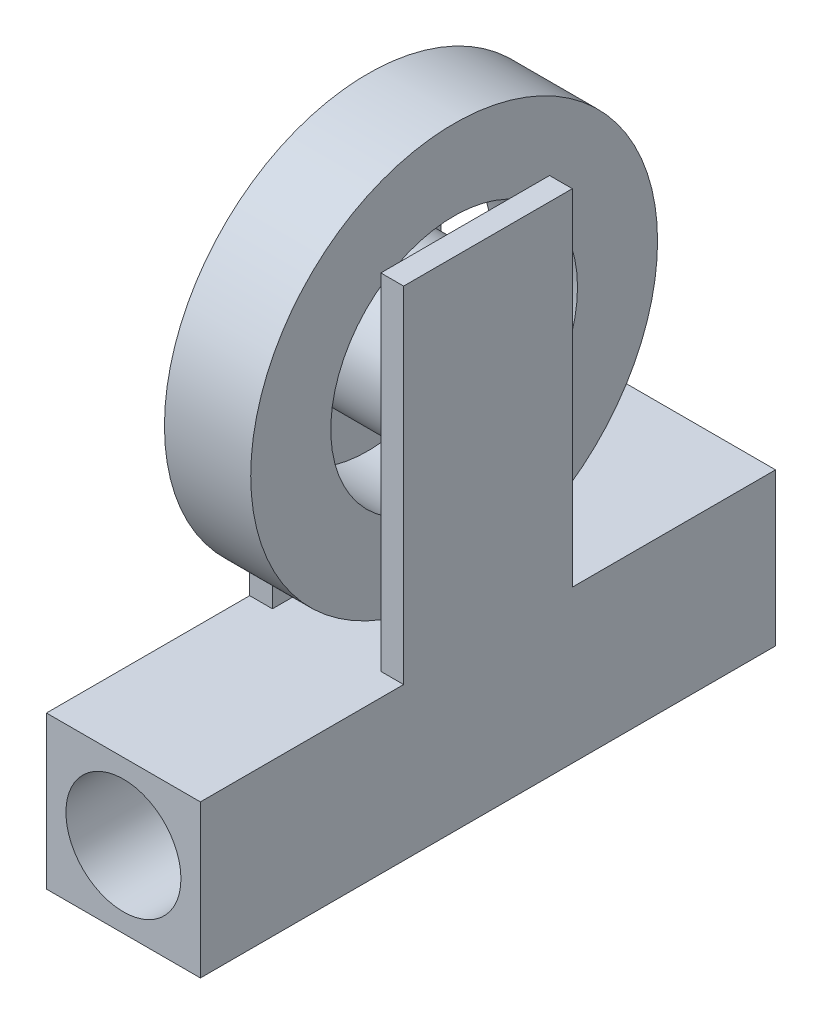
ISO-10303-21;
HEADER;
FILE_DESCRIPTION(('STEP AP214'),'2;1');
FILE_NAME('part.step','',(''),(''),'','','');
FILE_SCHEMA(('AUTOMOTIVE_DESIGN { 1 0 10303 214 1 1 1 1 }'));
ENDSEC;
DATA;
#1=APPLICATION_CONTEXT('core data for automotive mechanical design processes');
#2=APPLICATION_PROTOCOL_DEFINITION('international standard','automotive_design',2000,#1);
#3=PRODUCT_CONTEXT('',#1,'mechanical');
#4=PRODUCT('Part','Part','',(#3));
#5=PRODUCT_RELATED_PRODUCT_CATEGORY('part','',(#4));
#6=PRODUCT_DEFINITION_FORMATION('','',#4);
#7=PRODUCT_DEFINITION_CONTEXT('part definition',#1,'design');
#8=PRODUCT_DEFINITION('design','',#6,#7);
#9=PRODUCT_DEFINITION_SHAPE('','',#8);
#10=(LENGTH_UNIT() NAMED_UNIT(*) SI_UNIT(.MILLI.,.METRE.));
#11=(NAMED_UNIT(*) PLANE_ANGLE_UNIT() SI_UNIT($,.RADIAN.));
#12=(NAMED_UNIT(*) SI_UNIT($,.STERADIAN.) SOLID_ANGLE_UNIT());
#13=UNCERTAINTY_MEASURE_WITH_UNIT(LENGTH_MEASURE(1.E-05),#10,'distance_accuracy_value','');
#14=(GEOMETRIC_REPRESENTATION_CONTEXT(3) GLOBAL_UNCERTAINTY_ASSIGNED_CONTEXT((#13)) GLOBAL_UNIT_ASSIGNED_CONTEXT((#10,
#11,#12)) REPRESENTATION_CONTEXT('',''));
#15=CARTESIAN_POINT('',(0.,0.,0.));
#16=DIRECTION('',(0.,0.,1.));
#17=DIRECTION('',(1.,0.,0.));
#18=AXIS2_PLACEMENT_3D('',#15,#16,#17);
#19=CARTESIAN_POINT('',(7.5,52.0991490363418,50.));
#20=DIRECTION('',(1.,0.,0.));
#21=DIRECTION('',(0.,0.,-1.));
#22=AXIS2_PLACEMENT_3D('',#19,#20,#21);
#23=PLANE('',#22);
#24=CARTESIAN_POINT('',(7.5,52.0991490363418,50.));
#25=DIRECTION('',(1.,0.,0.));
#26=DIRECTION('',(0.,0.,-1.));
#27=AXIS2_PLACEMENT_3D('',#24,#25,#26);
#28=CIRCLE('',#27,35.3684202723915);
#29=CARTESIAN_POINT('',(7.5,52.0991490363418,14.6315797276085));
#30=VERTEX_POINT('',#29);
#31=EDGE_CURVE('E11',#30,#30,#28,.T.);
#32=ORIENTED_EDGE('',*,*,#31,.T.);
#33=EDGE_LOOP('',(#32));
#34=FACE_BOUND('',#33,.T.);
#35=CARTESIAN_POINT('',(7.5,52.0991490363418,50.));
#36=DIRECTION('',(1.,0.,0.));
#37=DIRECTION('',(0.,0.,-1.));
#38=AXIS2_PLACEMENT_3D('',#35,#36,#37);
#39=CIRCLE('',#38,21.4506027690178);
#40=CARTESIAN_POINT('',(7.5,52.0991490363418,28.5493972309823));
#41=VERTEX_POINT('',#40);
#42=EDGE_CURVE('E62',#41,#41,#39,.T.);
#43=ORIENTED_EDGE('',*,*,#42,.F.);
#44=EDGE_LOOP('',(#43));
#45=FACE_BOUND('',#44,.T.);
#46=ADVANCED_FACE('F51',(#34,#45),#23,.T.);
#47=CARTESIAN_POINT('',(-7.5,52.0991490363418,50.));
#48=DIRECTION('',(1.,0.,0.));
#49=DIRECTION('',(0.,0.,-1.));
#50=AXIS2_PLACEMENT_3D('',#47,#48,#49);
#51=PLANE('',#50);
#52=CARTESIAN_POINT('',(-7.5,52.0991490363418,50.));
#53=DIRECTION('',(1.,0.,0.));
#54=DIRECTION('',(0.,0.,-1.));
#55=AXIS2_PLACEMENT_3D('',#52,#53,#54);
#56=CIRCLE('',#55,35.3684202723915);
#57=CARTESIAN_POINT('',(-7.5,52.0991490363418,14.6315797276085));
#58=VERTEX_POINT('',#57);
#59=EDGE_CURVE('E55',#58,#58,#56,.T.);
#60=ORIENTED_EDGE('',*,*,#59,.F.);
#61=EDGE_LOOP('',(#60));
#62=FACE_BOUND('',#61,.T.);
#63=CARTESIAN_POINT('',(-7.5,52.0991490363418,50.));
#64=DIRECTION('',(1.,0.,0.));
#65=DIRECTION('',(0.,0.,-1.));
#66=AXIS2_PLACEMENT_3D('',#63,#64,#65);
#67=CIRCLE('',#66,21.4506027690178);
#68=CARTESIAN_POINT('',(-7.5,52.0991490363418,28.5493972309823));
#69=VERTEX_POINT('',#68);
#70=EDGE_CURVE('E64',#69,#69,#67,.T.);
#71=ORIENTED_EDGE('',*,*,#70,.T.);
#72=EDGE_LOOP('',(#71));
#73=FACE_BOUND('',#72,.T.);
#74=ADVANCED_FACE('F74',(#62,#73),#51,.F.);
#75=CARTESIAN_POINT('',(7.5,52.0991490363418,50.));
#76=DIRECTION('',(-1.,0.,0.));
#77=DIRECTION('',(0.,0.,1.));
#78=AXIS2_PLACEMENT_3D('',#75,#76,#77);
#79=CYLINDRICAL_SURFACE('',#78,35.3684202723915);
#80=ORIENTED_EDGE('',*,*,#31,.F.);
#81=EDGE_LOOP('',(#80));
#82=FACE_BOUND('',#81,.T.);
#83=ORIENTED_EDGE('',*,*,#59,.T.);
#84=EDGE_LOOP('',(#83));
#85=FACE_BOUND('',#84,.T.);
#86=ADVANCED_FACE('F53',(#82,#85),#79,.T.);
#87=CARTESIAN_POINT('',(7.5,52.0991490363418,50.));
#88=DIRECTION('',(-1.,0.,0.));
#89=DIRECTION('',(0.,0.,1.));
#90=AXIS2_PLACEMENT_3D('',#87,#88,#89);
#91=CYLINDRICAL_SURFACE('',#90,21.4506027690178);
#92=ORIENTED_EDGE('',*,*,#42,.T.);
#93=EDGE_LOOP('',(#92));
#94=FACE_BOUND('',#93,.T.);
#95=ORIENTED_EDGE('',*,*,#70,.F.);
#96=EDGE_LOOP('',(#95));
#97=FACE_BOUND('',#96,.T.);
#98=ADVANCED_FACE('F70',(#94,#97),#91,.F.);
#99=CLOSED_SHELL('',(#46,#74,#86,#98));
#100=MANIFOLD_SOLID_BREP('B2',#99);
#101=CARTESIAN_POINT('',(-13.3844816451149,13.2593930316092,100.));
#102=DIRECTION('',(0.,-1.,0.));
#103=DIRECTION('',(0.,0.,-1.));
#104=AXIS2_PLACEMENT_3D('',#101,#102,#103);
#105=PLANE('',#104);
#106=DIRECTION('',(1.,0.,0.));
#107=VECTOR('',#106,1.);
#108=CARTESIAN_POINT('',(13.3844816451149,13.2593930316092,64.6654291948844));
#109=LINE('',#108,#107);
#110=CARTESIAN_POINT('',(9.42369725511215,13.2593930316092,64.6654291948844));
#111=VERTEX_POINT('',#110);
#112=CARTESIAN_POINT('',(13.3844816451149,13.2593930316092,64.6654291948844));
#113=VERTEX_POINT('',#112);
#114=EDGE_CURVE('E137',#111,#113,#109,.T.);
#115=ORIENTED_EDGE('',*,*,#114,.F.);
#116=DIRECTION('',(0.,0.,1.));
#117=VECTOR('',#116,1.);
#118=CARTESIAN_POINT('',(9.42369725511215,13.2593930316092,64.6654291948844));
#119=LINE('',#118,#117);
#120=CARTESIAN_POINT('',(9.42369725511215,13.2593930316092,35.3345708051156));
#121=VERTEX_POINT('',#120);
#122=EDGE_CURVE('E142',#121,#111,#119,.T.);
#123=ORIENTED_EDGE('',*,*,#122,.F.);
#124=DIRECTION('',(-1.,0.,0.));
#125=VECTOR('',#124,1.);
#126=CARTESIAN_POINT('',(9.42369725511215,13.2593930316092,35.3345708051156));
#127=LINE('',#126,#125);
#128=CARTESIAN_POINT('',(13.3844816451149,13.2593930316092,35.3345708051156));
#129=VERTEX_POINT('',#128);
#130=EDGE_CURVE('E222',#129,#121,#127,.T.);
#131=ORIENTED_EDGE('',*,*,#130,.F.);
#132=DIRECTION('',(0.,0.,-1.));
#133=VECTOR('',#132,1.);
#134=CARTESIAN_POINT('',(13.3844816451149,13.2593930316092,100.));
#135=LINE('',#134,#133);
#136=CARTESIAN_POINT('',(13.3844816451149,13.2593930316092,0.));
#137=VERTEX_POINT('',#136);
#138=EDGE_CURVE('E131',#129,#137,#135,.T.);
#139=ORIENTED_EDGE('',*,*,#138,.T.);
#140=DIRECTION('',(-1.,0.,0.));
#141=VECTOR('',#140,1.);
#142=CARTESIAN_POINT('',(-13.3844816451149,13.2593930316092,0.));
#143=LINE('',#142,#141);
#144=CARTESIAN_POINT('',(-13.3844816451149,13.2593930316092,0.));
#145=VERTEX_POINT('',#144);
#146=EDGE_CURVE('E324',#137,#145,#143,.T.);
#147=ORIENTED_EDGE('',*,*,#146,.T.);
#148=DIRECTION('',(0.,0.,-1.));
#149=VECTOR('',#148,1.);
#150=CARTESIAN_POINT('',(-13.3844816451149,13.2593930316092,100.));
#151=LINE('',#150,#149);
#152=CARTESIAN_POINT('',(-13.3844816451149,13.2593930316092,35.3345708051156));
#153=VERTEX_POINT('',#152);
#154=EDGE_CURVE('E338',#153,#145,#151,.T.);
#155=ORIENTED_EDGE('',*,*,#154,.F.);
#156=DIRECTION('',(-1.,0.,0.));
#157=VECTOR('',#156,1.);
#158=CARTESIAN_POINT('',(-9.42369725511215,13.2593930316092,35.3345708051156));
#159=LINE('',#158,#157);
#160=CARTESIAN_POINT('',(-9.42369725511215,13.2593930316092,35.3345708051156));
#161=VERTEX_POINT('',#160);
#162=EDGE_CURVE('E247',#161,#153,#159,.T.);
#163=ORIENTED_EDGE('',*,*,#162,.F.);
#164=DIRECTION('',(0.,0.,-1.));
#165=VECTOR('',#164,1.);
#166=CARTESIAN_POINT('',(-9.42369725511215,13.2593930316092,64.6654291948844));
#167=LINE('',#166,#165);
#168=CARTESIAN_POINT('',(-9.42369725511215,13.2593930316092,64.6654291948844));
#169=VERTEX_POINT('',#168);
#170=EDGE_CURVE('E264',#169,#161,#167,.T.);
#171=ORIENTED_EDGE('',*,*,#170,.F.);
#172=DIRECTION('',(1.,0.,0.));
#173=VECTOR('',#172,1.);
#174=CARTESIAN_POINT('',(-13.3844816451149,13.2593930316092,64.6654291948844));
#175=LINE('',#174,#173);
#176=CARTESIAN_POINT('',(-13.3844816451149,13.2593930316092,64.6654291948844));
#177=VERTEX_POINT('',#176);
#178=EDGE_CURVE('E277',#177,#169,#175,.T.);
#179=ORIENTED_EDGE('',*,*,#178,.F.);
#180=CARTESIAN_POINT('',(-13.3844816451149,13.2593930316092,100.));
#181=VERTEX_POINT('',#180);
#182=EDGE_CURVE('E221',#181,#177,#151,.T.);
#183=ORIENTED_EDGE('',*,*,#182,.F.);
#184=DIRECTION('',(-1.,0.,0.));
#185=VECTOR('',#184,1.);
#186=CARTESIAN_POINT('',(-13.3844816451149,13.2593930316092,100.));
#187=LINE('',#186,#185);
#188=CARTESIAN_POINT('',(13.3844816451149,13.2593930316092,100.));
#189=VERTEX_POINT('',#188);
#190=EDGE_CURVE('E311',#189,#181,#187,.T.);
#191=ORIENTED_EDGE('',*,*,#190,.F.);
#192=EDGE_CURVE('E49',#189,#113,#135,.T.);
#193=ORIENTED_EDGE('',*,*,#192,.T.);
#194=EDGE_LOOP('',(#115,#123,#131,#139,#147,#155,#163,#171,#179,#183,#191,#193));
#195=FACE_BOUND('',#194,.T.);
#196=ADVANCED_FACE('F121',(#195),#105,.F.);
#197=CARTESIAN_POINT('',(0.,0.,100.));
#198=DIRECTION('',(0.,0.,1.));
#199=DIRECTION('',(1.,0.,0.));
#200=AXIS2_PLACEMENT_3D('',#197,#198,#199);
#201=PLANE('',#200);
#202=DIRECTION('',(0.,1.,0.));
#203=VECTOR('',#202,1.);
#204=CARTESIAN_POINT('',(13.3844816451149,13.2593930316092,100.));
#205=LINE('',#204,#203);
#206=CARTESIAN_POINT('',(13.3844816451149,-13.2593930316092,100.));
#207=VERTEX_POINT('',#206);
#208=EDGE_CURVE('E307',#207,#189,#205,.T.);
#209=ORIENTED_EDGE('',*,*,#208,.T.);
#210=ORIENTED_EDGE('',*,*,#190,.T.);
#211=DIRECTION('',(0.,-1.,0.));
#212=VECTOR('',#211,1.);
#213=CARTESIAN_POINT('',(-13.3844816451149,13.2593930316092,100.));
#214=LINE('',#213,#212);
#215=CARTESIAN_POINT('',(-13.3844816451149,-13.2593930316092,100.));
#216=VERTEX_POINT('',#215);
#217=EDGE_CURVE('E315',#181,#216,#214,.T.);
#218=ORIENTED_EDGE('',*,*,#217,.T.);
#219=DIRECTION('',(1.,0.,0.));
#220=VECTOR('',#219,1.);
#221=CARTESIAN_POINT('',(-13.3844816451149,-13.2593930316092,100.));
#222=LINE('',#221,#220);
#223=EDGE_CURVE('E318',#216,#207,#222,.T.);
#224=ORIENTED_EDGE('',*,*,#223,.T.);
#225=EDGE_LOOP('',(#209,#210,#218,#224));
#226=FACE_BOUND('',#225,.T.);
#227=CARTESIAN_POINT('',(0.,0.,100.));
#228=DIRECTION('',(0.,0.,1.));
#229=DIRECTION('',(1.,0.,0.));
#230=AXIS2_PLACEMENT_3D('',#227,#228,#229);
#231=CIRCLE('',#230,10.);
#232=CARTESIAN_POINT('',(10.,0.,100.));
#233=VERTEX_POINT('',#232);
#234=EDGE_CURVE('E300',#233,#233,#231,.T.);
#235=ORIENTED_EDGE('',*,*,#234,.F.);
#236=EDGE_LOOP('',(#235));
#237=FACE_BOUND('',#236,.T.);
#238=ADVANCED_FACE('F361',(#226,#237),#201,.T.);
#239=CARTESIAN_POINT('',(0.,0.,0.));
#240=DIRECTION('',(0.,0.,1.));
#241=DIRECTION('',(1.,0.,0.));
#242=AXIS2_PLACEMENT_3D('',#239,#240,#241);
#243=PLANE('',#242);
#244=DIRECTION('',(0.,1.,0.));
#245=VECTOR('',#244,1.);
#246=CARTESIAN_POINT('',(13.3844816451149,13.2593930316092,0.));
#247=LINE('',#246,#245);
#248=CARTESIAN_POINT('',(13.3844816451149,-13.2593930316092,0.));
#249=VERTEX_POINT('',#248);
#250=EDGE_CURVE('E217',#249,#137,#247,.T.);
#251=ORIENTED_EDGE('',*,*,#250,.F.);
#252=DIRECTION('',(1.,0.,0.));
#253=VECTOR('',#252,1.);
#254=CARTESIAN_POINT('',(-13.3844816451149,-13.2593930316092,0.));
#255=LINE('',#254,#253);
#256=CARTESIAN_POINT('',(-13.3844816451149,-13.2593930316092,0.));
#257=VERTEX_POINT('',#256);
#258=EDGE_CURVE('E312',#257,#249,#255,.T.);
#259=ORIENTED_EDGE('',*,*,#258,.F.);
#260=DIRECTION('',(0.,-1.,0.));
#261=VECTOR('',#260,1.);
#262=CARTESIAN_POINT('',(-13.3844816451149,13.2593930316092,0.));
#263=LINE('',#262,#261);
#264=EDGE_CURVE('E327',#145,#257,#263,.T.);
#265=ORIENTED_EDGE('',*,*,#264,.F.);
#266=ORIENTED_EDGE('',*,*,#146,.F.);
#267=EDGE_LOOP('',(#251,#259,#265,#266));
#268=FACE_BOUND('',#267,.T.);
#269=CARTESIAN_POINT('',(0.,0.,0.));
#270=DIRECTION('',(0.,0.,1.));
#271=DIRECTION('',(1.,0.,0.));
#272=AXIS2_PLACEMENT_3D('',#269,#270,#271);
#273=CIRCLE('',#272,10.);
#274=CARTESIAN_POINT('',(10.,0.,0.));
#275=VERTEX_POINT('',#274);
#276=EDGE_CURVE('E299',#275,#275,#273,.T.);
#277=ORIENTED_EDGE('',*,*,#276,.T.);
#278=EDGE_LOOP('',(#277));
#279=FACE_BOUND('',#278,.T.);
#280=ADVANCED_FACE('F352',(#268,#279),#243,.F.);
#281=CARTESIAN_POINT('',(13.3844816451149,13.2593930316092,100.));
#282=DIRECTION('',(-1.,0.,0.));
#283=DIRECTION('',(0.,0.,1.));
#284=AXIS2_PLACEMENT_3D('',#281,#282,#283);
#285=PLANE('',#284);
#286=ORIENTED_EDGE('',*,*,#250,.T.);
#287=ORIENTED_EDGE('',*,*,#138,.F.);
#288=DIRECTION('',(0.,-1.,0.));
#289=VECTOR('',#288,1.);
#290=CARTESIAN_POINT('',(13.3844816451149,73.2593930316092,35.3345708051156));
#291=LINE('',#290,#289);
#292=CARTESIAN_POINT('',(13.3844816451149,73.2593930316092,35.3345708051156));
#293=VERTEX_POINT('',#292);
#294=EDGE_CURVE('E213',#293,#129,#291,.T.);
#295=ORIENTED_EDGE('',*,*,#294,.F.);
#296=DIRECTION('',(0.,0.,-1.));
#297=VECTOR('',#296,1.);
#298=CARTESIAN_POINT('',(13.3844816451149,73.2593930316092,35.3345708051156));
#299=LINE('',#298,#297);
#300=CARTESIAN_POINT('',(13.3844816451149,73.2593930316092,64.6654291948844));
#301=VERTEX_POINT('',#300);
#302=EDGE_CURVE('E250',#301,#293,#299,.T.);
#303=ORIENTED_EDGE('',*,*,#302,.F.);
#304=DIRECTION('',(0.,-1.,0.));
#305=VECTOR('',#304,1.);
#306=CARTESIAN_POINT('',(13.3844816451149,73.2593930316092,64.6654291948844));
#307=LINE('',#306,#305);
#308=EDGE_CURVE('E233',#301,#113,#307,.T.);
#309=ORIENTED_EDGE('',*,*,#308,.T.);
#310=ORIENTED_EDGE('',*,*,#192,.F.);
#311=ORIENTED_EDGE('',*,*,#208,.F.);
#312=DIRECTION('',(0.,0.,-1.));
#313=VECTOR('',#312,1.);
#314=CARTESIAN_POINT('',(13.3844816451149,-13.2593930316092,100.));
#315=LINE('',#314,#313);
#316=EDGE_CURVE('E321',#207,#249,#315,.T.);
#317=ORIENTED_EDGE('',*,*,#316,.T.);
#318=EDGE_LOOP('',(#286,#287,#295,#303,#309,#310,#311,#317));
#319=FACE_BOUND('',#318,.T.);
#320=ADVANCED_FACE('F123',(#319),#285,.F.);
#321=CARTESIAN_POINT('',(-13.3844816451149,13.2593930316092,100.));
#322=DIRECTION('',(1.,0.,0.));
#323=DIRECTION('',(0.,0.,-1.));
#324=AXIS2_PLACEMENT_3D('',#321,#322,#323);
#325=PLANE('',#324);
#326=ORIENTED_EDGE('',*,*,#264,.T.);
#327=DIRECTION('',(0.,0.,-1.));
#328=VECTOR('',#327,1.);
#329=CARTESIAN_POINT('',(-13.3844816451149,-13.2593930316092,100.));
#330=LINE('',#329,#328);
#331=EDGE_CURVE('E334',#216,#257,#330,.T.);
#332=ORIENTED_EDGE('',*,*,#331,.F.);
#333=ORIENTED_EDGE('',*,*,#217,.F.);
#334=ORIENTED_EDGE('',*,*,#182,.T.);
#335=DIRECTION('',(0.,-1.,0.));
#336=VECTOR('',#335,1.);
#337=CARTESIAN_POINT('',(-13.3844816451149,73.2593930316092,64.6654291948844));
#338=LINE('',#337,#336);
#339=CARTESIAN_POINT('',(-13.3844816451149,73.2593930316092,64.6654291948844));
#340=VERTEX_POINT('',#339);
#341=EDGE_CURVE('E291',#340,#177,#338,.T.);
#342=ORIENTED_EDGE('',*,*,#341,.F.);
#343=DIRECTION('',(0.,0.,1.));
#344=VECTOR('',#343,1.);
#345=CARTESIAN_POINT('',(-13.3844816451149,73.2593930316092,35.3345708051156));
#346=LINE('',#345,#344);
#347=CARTESIAN_POINT('',(-13.3844816451149,73.2593930316092,35.3345708051156));
#348=VERTEX_POINT('',#347);
#349=EDGE_CURVE('E263',#348,#340,#346,.T.);
#350=ORIENTED_EDGE('',*,*,#349,.F.);
#351=DIRECTION('',(0.,-1.,0.));
#352=VECTOR('',#351,1.);
#353=CARTESIAN_POINT('',(-13.3844816451149,73.2593930316092,35.3345708051156));
#354=LINE('',#353,#352);
#355=EDGE_CURVE('E295',#348,#153,#354,.T.);
#356=ORIENTED_EDGE('',*,*,#355,.T.);
#357=ORIENTED_EDGE('',*,*,#154,.T.);
#358=EDGE_LOOP('',(#326,#332,#333,#334,#342,#350,#356,#357));
#359=FACE_BOUND('',#358,.T.);
#360=ADVANCED_FACE('F346',(#359),#325,.F.);
#361=CARTESIAN_POINT('',(-13.3844816451149,-13.2593930316092,100.));
#362=DIRECTION('',(0.,1.,0.));
#363=DIRECTION('',(0.,0.,1.));
#364=AXIS2_PLACEMENT_3D('',#361,#362,#363);
#365=PLANE('',#364);
#366=ORIENTED_EDGE('',*,*,#258,.T.);
#367=ORIENTED_EDGE('',*,*,#316,.F.);
#368=ORIENTED_EDGE('',*,*,#223,.F.);
#369=ORIENTED_EDGE('',*,*,#331,.T.);
#370=EDGE_LOOP('',(#366,#367,#368,#369));
#371=FACE_BOUND('',#370,.T.);
#372=ADVANCED_FACE('F356',(#371),#365,.F.);
#373=CARTESIAN_POINT('',(0.,0.,100.));
#374=DIRECTION('',(0.,0.,-1.));
#375=DIRECTION('',(-1.,0.,0.));
#376=AXIS2_PLACEMENT_3D('',#373,#374,#375);
#377=CYLINDRICAL_SURFACE('',#376,10.);
#378=ORIENTED_EDGE('',*,*,#234,.T.);
#379=EDGE_LOOP('',(#378));
#380=FACE_BOUND('',#379,.T.);
#381=ORIENTED_EDGE('',*,*,#276,.F.);
#382=EDGE_LOOP('',(#381));
#383=FACE_BOUND('',#382,.T.);
#384=ADVANCED_FACE('F377',(#380,#383),#377,.F.);
#385=CARTESIAN_POINT('',(-9.42369725511215,73.2593930316092,35.3345708051156));
#386=DIRECTION('',(0.,0.,1.));
#387=DIRECTION('',(1.,0.,0.));
#388=AXIS2_PLACEMENT_3D('',#385,#386,#387);
#389=PLANE('',#388);
#390=ORIENTED_EDGE('',*,*,#162,.T.);
#391=ORIENTED_EDGE('',*,*,#355,.F.);
#392=DIRECTION('',(-1.,0.,0.));
#393=VECTOR('',#392,1.);
#394=CARTESIAN_POINT('',(-9.42369725511215,73.2593930316092,35.3345708051156));
#395=LINE('',#394,#393);
#396=CARTESIAN_POINT('',(-9.42369725511215,73.2593930316092,35.3345708051156));
#397=VERTEX_POINT('',#396);
#398=EDGE_CURVE('E259',#397,#348,#395,.T.);
#399=ORIENTED_EDGE('',*,*,#398,.F.);
#400=DIRECTION('',(0.,-1.,0.));
#401=VECTOR('',#400,1.);
#402=CARTESIAN_POINT('',(-9.42369725511215,73.2593930316092,35.3345708051156));
#403=LINE('',#402,#401);
#404=EDGE_CURVE('E273',#397,#161,#403,.T.);
#405=ORIENTED_EDGE('',*,*,#404,.T.);
#406=EDGE_LOOP('',(#390,#391,#399,#405));
#407=FACE_BOUND('',#406,.T.);
#408=ADVANCED_FACE('F375',(#407),#389,.F.);
#409=CARTESIAN_POINT('',(-13.3844816451149,73.2593930316092,64.6654291948844));
#410=DIRECTION('',(0.,0.,-1.));
#411=DIRECTION('',(-1.,0.,0.));
#412=AXIS2_PLACEMENT_3D('',#409,#410,#411);
#413=PLANE('',#412);
#414=ORIENTED_EDGE('',*,*,#178,.T.);
#415=DIRECTION('',(0.,-1.,0.));
#416=VECTOR('',#415,1.);
#417=CARTESIAN_POINT('',(-9.42369725511215,73.2593930316092,64.6654291948844));
#418=LINE('',#417,#416);
#419=CARTESIAN_POINT('',(-9.42369725511215,73.2593930316092,64.6654291948844));
#420=VERTEX_POINT('',#419);
#421=EDGE_CURVE('E287',#420,#169,#418,.T.);
#422=ORIENTED_EDGE('',*,*,#421,.F.);
#423=DIRECTION('',(1.,0.,0.));
#424=VECTOR('',#423,1.);
#425=CARTESIAN_POINT('',(-13.3844816451149,73.2593930316092,64.6654291948844));
#426=LINE('',#425,#424);
#427=EDGE_CURVE('E267',#340,#420,#426,.T.);
#428=ORIENTED_EDGE('',*,*,#427,.F.);
#429=ORIENTED_EDGE('',*,*,#341,.T.);
#430=EDGE_LOOP('',(#414,#422,#428,#429));
#431=FACE_BOUND('',#430,.T.);
#432=ADVANCED_FACE('F365',(#431),#413,.F.);
#433=CARTESIAN_POINT('',(-9.42369725511215,73.2593930316092,64.6654291948844));
#434=DIRECTION('',(-1.,0.,0.));
#435=DIRECTION('',(0.,0.,1.));
#436=AXIS2_PLACEMENT_3D('',#433,#434,#435);
#437=PLANE('',#436);
#438=CARTESIAN_POINT('',(-9.42369725511215,52.0991490363418,50.));
#439=DIRECTION('',(-1.,0.,0.));
#440=DIRECTION('',(0.,0.,1.));
#441=AXIS2_PLACEMENT_3D('',#438,#439,#440);
#442=CIRCLE('',#441,12.7426514114775);
#443=CARTESIAN_POINT('',(-9.42369725511215,52.0991490363418,62.7426514114775));
#444=VERTEX_POINT('',#443);
#445=EDGE_CURVE('E534',#444,#444,#442,.F.);
#446=ORIENTED_EDGE('',*,*,#445,.F.);
#447=EDGE_LOOP('',(#446));
#448=FACE_BOUND('',#447,.T.);
#449=ORIENTED_EDGE('',*,*,#170,.T.);
#450=ORIENTED_EDGE('',*,*,#404,.F.);
#451=DIRECTION('',(0.,0.,-1.));
#452=VECTOR('',#451,1.);
#453=CARTESIAN_POINT('',(-9.42369725511215,73.2593930316092,64.6654291948844));
#454=LINE('',#453,#452);
#455=EDGE_CURVE('E270',#420,#397,#454,.T.);
#456=ORIENTED_EDGE('',*,*,#455,.F.);
#457=ORIENTED_EDGE('',*,*,#421,.T.);
#458=EDGE_LOOP('',(#449,#450,#456,#457));
#459=FACE_BOUND('',#458,.T.);
#460=ADVANCED_FACE('F369',(#448,#459),#437,.F.);
#461=CARTESIAN_POINT('',(0.,73.2593930316092,0.));
#462=DIRECTION('',(0.,1.,0.));
#463=DIRECTION('',(0.,0.,1.));
#464=AXIS2_PLACEMENT_3D('',#461,#462,#463);
#465=PLANE('',#464);
#466=ORIENTED_EDGE('',*,*,#398,.T.);
#467=ORIENTED_EDGE('',*,*,#349,.T.);
#468=ORIENTED_EDGE('',*,*,#427,.T.);
#469=ORIENTED_EDGE('',*,*,#455,.T.);
#470=EDGE_LOOP('',(#466,#467,#468,#469));
#471=FACE_BOUND('',#470,.T.);
#472=ADVANCED_FACE('F373',(#471),#465,.T.);
#473=CARTESIAN_POINT('',(9.42369725511215,73.2593930316092,64.6654291948844));
#474=DIRECTION('',(1.,0.,0.));
#475=DIRECTION('',(0.,0.,-1.));
#476=AXIS2_PLACEMENT_3D('',#473,#474,#475);
#477=PLANE('',#476);
#478=CARTESIAN_POINT('',(9.42369725511215,52.0991490363418,50.));
#479=DIRECTION('',(1.,0.,0.));
#480=DIRECTION('',(0.,0.,-1.));
#481=AXIS2_PLACEMENT_3D('',#478,#479,#480);
#482=CIRCLE('',#481,12.7426514114775);
#483=CARTESIAN_POINT('',(9.42369725511215,52.0991490363418,37.2573485885225));
#484=VERTEX_POINT('',#483);
#485=EDGE_CURVE('E125',#484,#484,#482,.T.);
#486=ORIENTED_EDGE('',*,*,#485,.T.);
#487=EDGE_LOOP('',(#486));
#488=FACE_BOUND('',#487,.T.);
#489=ORIENTED_EDGE('',*,*,#122,.T.);
#490=DIRECTION('',(0.,-1.,0.));
#491=VECTOR('',#490,1.);
#492=CARTESIAN_POINT('',(9.42369725511215,73.2593930316092,64.6654291948844));
#493=LINE('',#492,#491);
#494=CARTESIAN_POINT('',(9.42369725511215,73.2593930316092,64.6654291948844));
#495=VERTEX_POINT('',#494);
#496=EDGE_CURVE('E239',#495,#111,#493,.T.);
#497=ORIENTED_EDGE('',*,*,#496,.F.);
#498=DIRECTION('',(0.,0.,1.));
#499=VECTOR('',#498,1.);
#500=CARTESIAN_POINT('',(9.42369725511215,73.2593930316092,64.6654291948844));
#501=LINE('',#500,#499);
#502=CARTESIAN_POINT('',(9.42369725511215,73.2593930316092,35.3345708051156));
#503=VERTEX_POINT('',#502);
#504=EDGE_CURVE('E227',#503,#495,#501,.T.);
#505=ORIENTED_EDGE('',*,*,#504,.F.);
#506=DIRECTION('',(0.,-1.,0.));
#507=VECTOR('',#506,1.);
#508=CARTESIAN_POINT('',(9.42369725511215,73.2593930316092,35.3345708051156));
#509=LINE('',#508,#507);
#510=EDGE_CURVE('E232',#503,#121,#509,.T.);
#511=ORIENTED_EDGE('',*,*,#510,.T.);
#512=EDGE_LOOP('',(#489,#497,#505,#511));
#513=FACE_BOUND('',#512,.T.);
#514=ADVANCED_FACE('F470',(#488,#513),#477,.F.);
#515=CARTESIAN_POINT('',(13.3844816451149,73.2593930316092,64.6654291948844));
#516=DIRECTION('',(0.,0.,-1.));
#517=DIRECTION('',(-1.,0.,0.));
#518=AXIS2_PLACEMENT_3D('',#515,#516,#517);
#519=PLANE('',#518);
#520=ORIENTED_EDGE('',*,*,#114,.T.);
#521=ORIENTED_EDGE('',*,*,#308,.F.);
#522=DIRECTION('',(1.,0.,0.));
#523=VECTOR('',#522,1.);
#524=CARTESIAN_POINT('',(13.3844816451149,73.2593930316092,64.6654291948844));
#525=LINE('',#524,#523);
#526=EDGE_CURVE('E253',#495,#301,#525,.T.);
#527=ORIENTED_EDGE('',*,*,#526,.F.);
#528=ORIENTED_EDGE('',*,*,#496,.T.);
#529=EDGE_LOOP('',(#520,#521,#527,#528));
#530=FACE_BOUND('',#529,.T.);
#531=ADVANCED_FACE('F480',(#530),#519,.F.);
#532=CARTESIAN_POINT('',(9.42369725511215,73.2593930316092,35.3345708051156));
#533=DIRECTION('',(0.,0.,1.));
#534=DIRECTION('',(1.,0.,0.));
#535=AXIS2_PLACEMENT_3D('',#532,#533,#534);
#536=PLANE('',#535);
#537=ORIENTED_EDGE('',*,*,#130,.T.);
#538=ORIENTED_EDGE('',*,*,#510,.F.);
#539=DIRECTION('',(-1.,0.,0.));
#540=VECTOR('',#539,1.);
#541=CARTESIAN_POINT('',(9.42369725511215,73.2593930316092,35.3345708051156));
#542=LINE('',#541,#540);
#543=EDGE_CURVE('E230',#293,#503,#542,.T.);
#544=ORIENTED_EDGE('',*,*,#543,.F.);
#545=ORIENTED_EDGE('',*,*,#294,.T.);
#546=EDGE_LOOP('',(#537,#538,#544,#545));
#547=FACE_BOUND('',#546,.T.);
#548=ADVANCED_FACE('F229',(#547),#536,.F.);
#549=CARTESIAN_POINT('',(0.,73.2593930316092,0.));
#550=DIRECTION('',(0.,-1.,0.));
#551=DIRECTION('',(0.,0.,-1.));
#552=AXIS2_PLACEMENT_3D('',#549,#550,#551);
#553=PLANE('',#552);
#554=ORIENTED_EDGE('',*,*,#504,.T.);
#555=ORIENTED_EDGE('',*,*,#526,.T.);
#556=ORIENTED_EDGE('',*,*,#302,.T.);
#557=ORIENTED_EDGE('',*,*,#543,.T.);
#558=EDGE_LOOP('',(#554,#555,#556,#557));
#559=FACE_BOUND('',#558,.T.);
#560=ADVANCED_FACE('F501',(#559),#553,.F.);
#561=CARTESIAN_POINT('',(-45.4653581485206,52.0991490363418,50.));
#562=DIRECTION('',(1.,0.,0.));
#563=DIRECTION('',(0.,0.,-1.));
#564=AXIS2_PLACEMENT_3D('',#561,#562,#563);
#565=CYLINDRICAL_SURFACE('',#564,12.7426514114775);
#566=ORIENTED_EDGE('',*,*,#445,.T.);
#567=EDGE_LOOP('',(#566));
#568=FACE_BOUND('',#567,.T.);
#569=ORIENTED_EDGE('',*,*,#485,.F.);
#570=EDGE_LOOP('',(#569));
#571=FACE_BOUND('',#570,.T.);
#572=ADVANCED_FACE('F510',(#568,#571),#565,.T.);
#573=CLOSED_SHELL('',(#196,#238,#280,#320,#360,#372,#384,#408,#432,#460,#472,#514,#531,#548,
#560,#572));
#574=MANIFOLD_SOLID_BREP('B6',#573);
#575=ADVANCED_BREP_SHAPE_REPRESENTATION('',(#18,#100,#574),#14);
#576=SHAPE_DEFINITION_REPRESENTATION(#9,#575);
ENDSEC;
END-ISO-10303-21;
